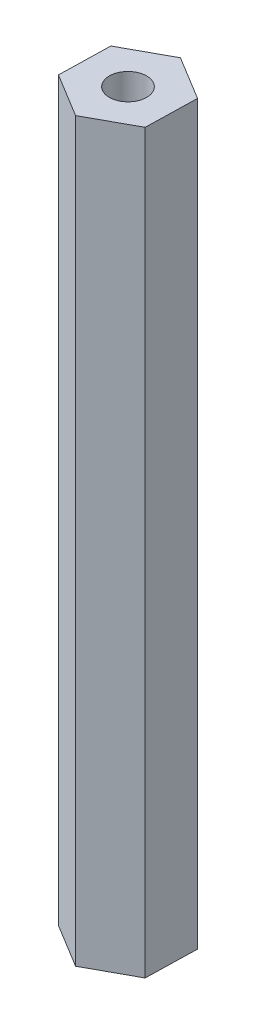
ISO-10303-21;
HEADER;
FILE_DESCRIPTION(('STEP AP214'),'2;1');
FILE_NAME('part.step','',(''),(''),'','','');
FILE_SCHEMA(('AUTOMOTIVE_DESIGN { 1 0 10303 214 1 1 1 1 }'));
ENDSEC;
DATA;
#1=APPLICATION_CONTEXT('core data for automotive mechanical design processes');
#2=APPLICATION_PROTOCOL_DEFINITION('international standard','automotive_design',2000,#1);
#3=PRODUCT_CONTEXT('',#1,'mechanical');
#4=PRODUCT('Part','Part','',(#3));
#5=PRODUCT_RELATED_PRODUCT_CATEGORY('part','',(#4));
#6=PRODUCT_DEFINITION_FORMATION('','',#4);
#7=PRODUCT_DEFINITION_CONTEXT('part definition',#1,'design');
#8=PRODUCT_DEFINITION('design','',#6,#7);
#9=PRODUCT_DEFINITION_SHAPE('','',#8);
#10=(LENGTH_UNIT() NAMED_UNIT(*) SI_UNIT(.MILLI.,.METRE.));
#11=(NAMED_UNIT(*) PLANE_ANGLE_UNIT() SI_UNIT($,.RADIAN.));
#12=(NAMED_UNIT(*) SI_UNIT($,.STERADIAN.) SOLID_ANGLE_UNIT());
#13=UNCERTAINTY_MEASURE_WITH_UNIT(LENGTH_MEASURE(1.E-05),#10,'distance_accuracy_value','');
#14=(GEOMETRIC_REPRESENTATION_CONTEXT(3) GLOBAL_UNCERTAINTY_ASSIGNED_CONTEXT((#13)) GLOBAL_UNIT_ASSIGNED_CONTEXT((#10,
#11,#12)) REPRESENTATION_CONTEXT('',''));
#15=CARTESIAN_POINT('',(0.,0.,0.));
#16=DIRECTION('',(0.,0.,1.));
#17=DIRECTION('',(1.,0.,0.));
#18=AXIS2_PLACEMENT_3D('',#15,#16,#17);
#19=CARTESIAN_POINT('',(4.93223870515652,41.5,3.0010589278935));
#20=DIRECTION('',(-0.999735132754464,0.,-0.0230144375645836));
#21=DIRECTION('',(-0.0230144375645836,0.,0.999735132754464));
#22=AXIS2_PLACEMENT_3D('',#19,#20,#21);
#23=PLANE('',#22);
#24=DIRECTION('',(0.0230144375645836,0.,-0.999735132754464));
#25=VECTOR('',#24,1.);
#26=CARTESIAN_POINT('',(4.93223870515652,-41.5,3.0010589278935));
#27=LINE('',#26,#25);
#28=CARTESIAN_POINT('',(4.93223870515652,-41.5,3.0010589278935));
#29=VERTEX_POINT('',#28);
#30=CARTESIAN_POINT('',(5.06511262238812,-41.5,-2.77091455224766));
#31=VERTEX_POINT('',#30);
#32=EDGE_CURVE('E125',#29,#31,#27,.T.);
#33=ORIENTED_EDGE('',*,*,#32,.T.);
#34=DIRECTION('',(0.,-1.,0.));
#35=VECTOR('',#34,1.);
#36=CARTESIAN_POINT('',(5.06511262238812,41.5,-2.77091455224766));
#37=LINE('',#36,#35);
#38=CARTESIAN_POINT('',(5.06511262238812,41.5,-2.77091455224766));
#39=VERTEX_POINT('',#38);
#40=EDGE_CURVE('E11',#39,#31,#37,.T.);
#41=ORIENTED_EDGE('',*,*,#40,.F.);
#42=DIRECTION('',(0.0230144375645836,0.,-0.999735132754464));
#43=VECTOR('',#42,1.);
#44=CARTESIAN_POINT('',(4.93223870515652,41.5,3.0010589278935));
#45=LINE('',#44,#43);
#46=CARTESIAN_POINT('',(4.93223870515652,41.5,3.0010589278935));
#47=VERTEX_POINT('',#46);
#48=EDGE_CURVE('E136',#47,#39,#45,.T.);
#49=ORIENTED_EDGE('',*,*,#48,.F.);
#50=DIRECTION('',(0.,-1.,0.));
#51=VECTOR('',#50,1.);
#52=CARTESIAN_POINT('',(4.93223870515652,41.5,3.0010589278935));
#53=LINE('',#52,#51);
#54=EDGE_CURVE('E121',#47,#29,#53,.T.);
#55=ORIENTED_EDGE('',*,*,#54,.T.);
#56=EDGE_LOOP('',(#33,#41,#49,#55));
#57=FACE_BOUND('',#56,.T.);
#58=ADVANCED_FACE('F41',(#57),#23,.F.);
#59=CARTESIAN_POINT('',(5.06511262238812,41.5,-2.77091455224766));
#60=DIRECTION('',(-0.519798653961972,0.,0.854288803238882));
#61=DIRECTION('',(0.854288803238882,0.,0.519798653961973));
#62=AXIS2_PLACEMENT_3D('',#59,#60,#61);
#63=PLANE('',#62);
#64=DIRECTION('',(-0.854288803238882,0.,-0.519798653961973));
#65=VECTOR('',#64,1.);
#66=CARTESIAN_POINT('',(5.06511262238812,-41.5,-2.77091455224766));
#67=LINE('',#66,#65);
#68=CARTESIAN_POINT('',(0.132873917231604,-41.5,-5.77197348014116));
#69=VERTEX_POINT('',#68);
#70=EDGE_CURVE('E128',#31,#69,#67,.T.);
#71=ORIENTED_EDGE('',*,*,#70,.T.);
#72=DIRECTION('',(0.,-1.,0.));
#73=VECTOR('',#72,1.);
#74=CARTESIAN_POINT('',(0.132873917231604,41.5,-5.77197348014116));
#75=LINE('',#74,#73);
#76=CARTESIAN_POINT('',(0.132873917231604,41.5,-5.77197348014116));
#77=VERTEX_POINT('',#76);
#78=EDGE_CURVE('E49',#77,#69,#75,.T.);
#79=ORIENTED_EDGE('',*,*,#78,.F.);
#80=DIRECTION('',(-0.854288803238882,0.,-0.519798653961973));
#81=VECTOR('',#80,1.);
#82=CARTESIAN_POINT('',(5.06511262238812,41.5,-2.77091455224766));
#83=LINE('',#82,#81);
#84=EDGE_CURVE('E94',#39,#77,#83,.T.);
#85=ORIENTED_EDGE('',*,*,#84,.F.);
#86=ORIENTED_EDGE('',*,*,#40,.T.);
#87=EDGE_LOOP('',(#71,#79,#85,#86));
#88=FACE_BOUND('',#87,.T.);
#89=ADVANCED_FACE('F161',(#88),#63,.F.);
#90=CARTESIAN_POINT('',(0.132873917231604,41.5,-5.77197348014116));
#91=DIRECTION('',(0.479936478792491,0.,0.877303240803466));
#92=DIRECTION('',(0.877303240803466,0.,-0.479936478792491));
#93=AXIS2_PLACEMENT_3D('',#90,#91,#92);
#94=PLANE('',#93);
#95=DIRECTION('',(-0.877303240803466,0.,0.479936478792492));
#96=VECTOR('',#95,1.);
#97=CARTESIAN_POINT('',(0.132873917231604,-41.5,-5.77197348014116));
#98=LINE('',#97,#96);
#99=CARTESIAN_POINT('',(-4.93223870515652,-41.5,-3.0010589278935));
#100=VERTEX_POINT('',#99);
#101=EDGE_CURVE('E131',#69,#100,#98,.T.);
#102=ORIENTED_EDGE('',*,*,#101,.T.);
#103=DIRECTION('',(0.,-1.,0.));
#104=VECTOR('',#103,1.);
#105=CARTESIAN_POINT('',(-4.93223870515652,41.5,-3.0010589278935));
#106=LINE('',#105,#104);
#107=CARTESIAN_POINT('',(-4.93223870515652,41.5,-3.0010589278935));
#108=VERTEX_POINT('',#107);
#109=EDGE_CURVE('E116',#108,#100,#106,.T.);
#110=ORIENTED_EDGE('',*,*,#109,.F.);
#111=DIRECTION('',(-0.877303240803466,0.,0.479936478792492));
#112=VECTOR('',#111,1.);
#113=CARTESIAN_POINT('',(0.132873917231604,41.5,-5.77197348014116));
#114=LINE('',#113,#112);
#115=EDGE_CURVE('E107',#77,#108,#114,.T.);
#116=ORIENTED_EDGE('',*,*,#115,.F.);
#117=ORIENTED_EDGE('',*,*,#78,.T.);
#118=EDGE_LOOP('',(#102,#110,#116,#117));
#119=FACE_BOUND('',#118,.T.);
#120=ADVANCED_FACE('F142',(#119),#94,.F.);
#121=CARTESIAN_POINT('',(-4.93223870515652,41.5,-3.0010589278935));
#122=DIRECTION('',(0.999735132754464,0.,0.0230144375645838));
#123=DIRECTION('',(0.0230144375645838,0.,-0.999735132754464));
#124=AXIS2_PLACEMENT_3D('',#121,#122,#123);
#125=PLANE('',#124);
#126=DIRECTION('',(-0.0230144375645838,0.,0.999735132754464));
#127=VECTOR('',#126,1.);
#128=CARTESIAN_POINT('',(-4.93223870515652,-41.5,-3.0010589278935));
#129=LINE('',#128,#127);
#130=CARTESIAN_POINT('',(-5.06511262238812,-41.5,2.77091455224766));
#131=VERTEX_POINT('',#130);
#132=EDGE_CURVE('E115',#100,#131,#129,.T.);
#133=ORIENTED_EDGE('',*,*,#132,.T.);
#134=DIRECTION('',(0.,-1.,0.));
#135=VECTOR('',#134,1.);
#136=CARTESIAN_POINT('',(-5.06511262238812,41.5,2.77091455224766));
#137=LINE('',#136,#135);
#138=CARTESIAN_POINT('',(-5.06511262238812,41.5,2.77091455224766));
#139=VERTEX_POINT('',#138);
#140=EDGE_CURVE('E112',#139,#131,#137,.T.);
#141=ORIENTED_EDGE('',*,*,#140,.F.);
#142=DIRECTION('',(-0.0230144375645838,0.,0.999735132754464));
#143=VECTOR('',#142,1.);
#144=CARTESIAN_POINT('',(-4.93223870515652,41.5,-3.0010589278935));
#145=LINE('',#144,#143);
#146=EDGE_CURVE('E101',#108,#139,#145,.T.);
#147=ORIENTED_EDGE('',*,*,#146,.F.);
#148=ORIENTED_EDGE('',*,*,#109,.T.);
#149=EDGE_LOOP('',(#133,#141,#147,#148));
#150=FACE_BOUND('',#149,.T.);
#151=ADVANCED_FACE('F113',(#150),#125,.F.);
#152=CARTESIAN_POINT('',(-5.06511262238812,41.5,2.77091455224766));
#153=DIRECTION('',(0.519798653961973,0.,-0.854288803238882));
#154=DIRECTION('',(-0.854288803238882,0.,-0.519798653961973));
#155=AXIS2_PLACEMENT_3D('',#152,#153,#154);
#156=PLANE('',#155);
#157=DIRECTION('',(0.854288803238882,0.,0.519798653961973));
#158=VECTOR('',#157,1.);
#159=CARTESIAN_POINT('',(-5.06511262238812,-41.5,2.77091455224766));
#160=LINE('',#159,#158);
#161=CARTESIAN_POINT('',(-0.132873917231602,-41.5,5.77197348014116));
#162=VERTEX_POINT('',#161);
#163=EDGE_CURVE('E80',#131,#162,#160,.T.);
#164=ORIENTED_EDGE('',*,*,#163,.T.);
#165=DIRECTION('',(0.,-1.,0.));
#166=VECTOR('',#165,1.);
#167=CARTESIAN_POINT('',(-0.132873917231602,41.5,5.77197348014116));
#168=LINE('',#167,#166);
#169=CARTESIAN_POINT('',(-0.132873917231602,41.5,5.77197348014116));
#170=VERTEX_POINT('',#169);
#171=EDGE_CURVE('E117',#170,#162,#168,.T.);
#172=ORIENTED_EDGE('',*,*,#171,.F.);
#173=DIRECTION('',(0.854288803238882,0.,0.519798653961973));
#174=VECTOR('',#173,1.);
#175=CARTESIAN_POINT('',(-5.06511262238812,41.5,2.77091455224766));
#176=LINE('',#175,#174);
#177=EDGE_CURVE('E105',#139,#170,#176,.T.);
#178=ORIENTED_EDGE('',*,*,#177,.F.);
#179=ORIENTED_EDGE('',*,*,#140,.T.);
#180=EDGE_LOOP('',(#164,#172,#178,#179));
#181=FACE_BOUND('',#180,.T.);
#182=ADVANCED_FACE('F119',(#181),#156,.F.);
#183=CARTESIAN_POINT('',(-0.132873917231602,41.5,5.77197348014116));
#184=DIRECTION('',(-0.479936478792492,0.,-0.877303240803466));
#185=DIRECTION('',(-0.877303240803466,0.,0.479936478792492));
#186=AXIS2_PLACEMENT_3D('',#183,#184,#185);
#187=PLANE('',#186);
#188=DIRECTION('',(0.877303240803466,0.,-0.479936478792492));
#189=VECTOR('',#188,1.);
#190=CARTESIAN_POINT('',(-0.132873917231602,-41.5,5.77197348014116));
#191=LINE('',#190,#189);
#192=EDGE_CURVE('E86',#162,#29,#191,.T.);
#193=ORIENTED_EDGE('',*,*,#192,.T.);
#194=ORIENTED_EDGE('',*,*,#54,.F.);
#195=DIRECTION('',(0.877303240803466,0.,-0.479936478792492));
#196=VECTOR('',#195,1.);
#197=CARTESIAN_POINT('',(-0.132873917231602,41.5,5.77197348014116));
#198=LINE('',#197,#196);
#199=EDGE_CURVE('E57',#170,#47,#198,.T.);
#200=ORIENTED_EDGE('',*,*,#199,.F.);
#201=ORIENTED_EDGE('',*,*,#171,.T.);
#202=EDGE_LOOP('',(#193,#194,#200,#201));
#203=FACE_BOUND('',#202,.T.);
#204=ADVANCED_FACE('F149',(#203),#187,.F.);
#205=CARTESIAN_POINT('',(0.,41.5,0.));
#206=DIRECTION('',(0.,1.,0.));
#207=DIRECTION('',(0.,0.,1.));
#208=AXIS2_PLACEMENT_3D('',#205,#206,#207);
#209=PLANE('',#208);
#210=CARTESIAN_POINT('',(0.,41.5,0.));
#211=DIRECTION('',(0.,1.,0.));
#212=DIRECTION('',(0.,0.,1.));
#213=AXIS2_PLACEMENT_3D('',#210,#211,#212);
#214=CIRCLE('',#213,2.1);
#215=CARTESIAN_POINT('',(0.,41.5,2.1));
#216=VERTEX_POINT('',#215);
#217=EDGE_CURVE('E220',#216,#216,#214,.T.);
#218=ORIENTED_EDGE('',*,*,#217,.F.);
#219=EDGE_LOOP('',(#218));
#220=FACE_BOUND('',#219,.T.);
#221=ORIENTED_EDGE('',*,*,#48,.T.);
#222=ORIENTED_EDGE('',*,*,#84,.T.);
#223=ORIENTED_EDGE('',*,*,#115,.T.);
#224=ORIENTED_EDGE('',*,*,#146,.T.);
#225=ORIENTED_EDGE('',*,*,#177,.T.);
#226=ORIENTED_EDGE('',*,*,#199,.T.);
#227=EDGE_LOOP('',(#221,#222,#223,#224,#225,#226));
#228=FACE_BOUND('',#227,.T.);
#229=ADVANCED_FACE('F103',(#220,#228),#209,.T.);
#230=CARTESIAN_POINT('',(0.,-41.5,0.));
#231=DIRECTION('',(0.,1.,0.));
#232=DIRECTION('',(0.,0.,1.));
#233=AXIS2_PLACEMENT_3D('',#230,#231,#232);
#234=PLANE('',#233);
#235=CARTESIAN_POINT('',(0.,-41.5,0.));
#236=DIRECTION('',(0.,1.,0.));
#237=DIRECTION('',(0.,0.,1.));
#238=AXIS2_PLACEMENT_3D('',#235,#236,#237);
#239=CIRCLE('',#238,2.1);
#240=CARTESIAN_POINT('',(0.,-41.5,2.1));
#241=VERTEX_POINT('',#240);
#242=EDGE_CURVE('E129',#241,#241,#239,.T.);
#243=ORIENTED_EDGE('',*,*,#242,.T.);
#244=EDGE_LOOP('',(#243));
#245=FACE_BOUND('',#244,.T.);
#246=ORIENTED_EDGE('',*,*,#32,.F.);
#247=ORIENTED_EDGE('',*,*,#192,.F.);
#248=ORIENTED_EDGE('',*,*,#163,.F.);
#249=ORIENTED_EDGE('',*,*,#132,.F.);
#250=ORIENTED_EDGE('',*,*,#101,.F.);
#251=ORIENTED_EDGE('',*,*,#70,.F.);
#252=EDGE_LOOP('',(#246,#247,#248,#249,#250,#251));
#253=FACE_BOUND('',#252,.T.);
#254=ADVANCED_FACE('F145',(#245,#253),#234,.F.);
#255=CARTESIAN_POINT('',(0.,-41.5,0.));
#256=DIRECTION('',(0.,1.,0.));
#257=DIRECTION('',(0.,0.,1.));
#258=AXIS2_PLACEMENT_3D('',#255,#256,#257);
#259=CYLINDRICAL_SURFACE('',#258,2.1);
#260=ORIENTED_EDGE('',*,*,#242,.F.);
#261=EDGE_LOOP('',(#260));
#262=FACE_BOUND('',#261,.T.);
#263=ORIENTED_EDGE('',*,*,#217,.T.);
#264=EDGE_LOOP('',(#263));
#265=FACE_BOUND('',#264,.T.);
#266=ADVANCED_FACE('F198',(#262,#265),#259,.F.);
#267=CLOSED_SHELL('',(#58,#89,#120,#151,#182,#204,#229,#254,#266));
#268=MANIFOLD_SOLID_BREP('B2',#267);
#269=ADVANCED_BREP_SHAPE_REPRESENTATION('',(#18,#268),#14);
#270=SHAPE_DEFINITION_REPRESENTATION(#9,#269);
ENDSEC;
END-ISO-10303-21;
